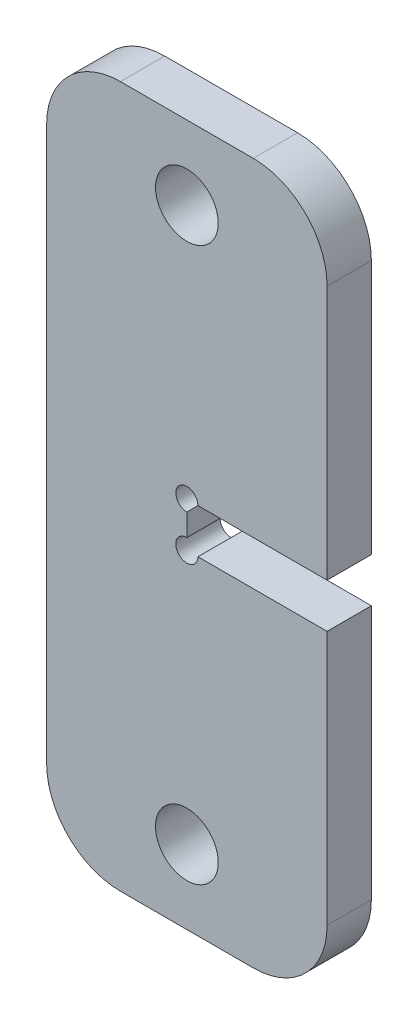
ISO-10303-21;
HEADER;
FILE_DESCRIPTION(('STEP AP214'),'2;1');
FILE_NAME('part.step','',(''),(''),'','','');
FILE_SCHEMA(('AUTOMOTIVE_DESIGN { 1 0 10303 214 1 1 1 1 }'));
ENDSEC;
DATA;
#1=APPLICATION_CONTEXT('core data for automotive mechanical design processes');
#2=APPLICATION_PROTOCOL_DEFINITION('international standard','automotive_design',2000,#1);
#3=PRODUCT_CONTEXT('',#1,'mechanical');
#4=PRODUCT('Part','Part','',(#3));
#5=PRODUCT_RELATED_PRODUCT_CATEGORY('part','',(#4));
#6=PRODUCT_DEFINITION_FORMATION('','',#4);
#7=PRODUCT_DEFINITION_CONTEXT('part definition',#1,'design');
#8=PRODUCT_DEFINITION('design','',#6,#7);
#9=PRODUCT_DEFINITION_SHAPE('','',#8);
#10=(LENGTH_UNIT() NAMED_UNIT(*) SI_UNIT(.MILLI.,.METRE.));
#11=(NAMED_UNIT(*) PLANE_ANGLE_UNIT() SI_UNIT($,.RADIAN.));
#12=(NAMED_UNIT(*) SI_UNIT($,.STERADIAN.) SOLID_ANGLE_UNIT());
#13=UNCERTAINTY_MEASURE_WITH_UNIT(LENGTH_MEASURE(1.E-05),#10,'distance_accuracy_value','');
#14=(GEOMETRIC_REPRESENTATION_CONTEXT(3) GLOBAL_UNCERTAINTY_ASSIGNED_CONTEXT((#13)) GLOBAL_UNIT_ASSIGNED_CONTEXT((#10,
#11,#12)) REPRESENTATION_CONTEXT('',''));
#15=CARTESIAN_POINT('',(0.,0.,0.));
#16=DIRECTION('',(0.,0.,1.));
#17=DIRECTION('',(1.,0.,0.));
#18=AXIS2_PLACEMENT_3D('',#15,#16,#17);
#19=CARTESIAN_POINT('',(714.,338.,11.));
#20=DIRECTION('',(0.,0.,1.));
#21=DIRECTION('',(1.,0.,0.));
#22=AXIS2_PLACEMENT_3D('',#19,#20,#21);
#23=PLANE('',#22);
#24=CARTESIAN_POINT('',(705.,378.5,11.));
#25=DIRECTION('',(0.,0.,1.));
#26=DIRECTION('',(1.,0.,0.));
#27=AXIS2_PLACEMENT_3D('',#24,#25,#26);
#28=CIRCLE('',#27,1.49999999999997);
#29=CARTESIAN_POINT('',(706.5,378.5,11.));
#30=VERTEX_POINT('',#29);
#31=CARTESIAN_POINT('',(705.,377.,11.));
#32=VERTEX_POINT('',#31);
#33=EDGE_CURVE('E136',#30,#32,#28,.T.);
#34=ORIENTED_EDGE('',*,*,#33,.F.);
#35=DIRECTION('',(-1.,0.,0.));
#36=VECTOR('',#35,1.);
#37=CARTESIAN_POINT('',(724.,378.5,11.));
#38=LINE('',#37,#36);
#39=CARTESIAN_POINT('',(724.,378.5,11.));
#40=VERTEX_POINT('',#39);
#41=EDGE_CURVE('E149',#40,#30,#38,.T.);
#42=ORIENTED_EDGE('',*,*,#41,.F.);
#43=DIRECTION('',(0.,-1.,0.));
#44=VECTOR('',#43,1.);
#45=CARTESIAN_POINT('',(724.,23.9999999999998,11.));
#46=LINE('',#45,#44);
#47=CARTESIAN_POINT('',(724.,413.,11.));
#48=VERTEX_POINT('',#47);
#49=EDGE_CURVE('E158',#48,#40,#46,.T.);
#50=ORIENTED_EDGE('',*,*,#49,.F.);
#51=CARTESIAN_POINT('',(714.,413.,11.));
#52=DIRECTION('',(0.,0.,1.));
#53=DIRECTION('',(1.,0.,0.));
#54=AXIS2_PLACEMENT_3D('',#51,#52,#53);
#55=CIRCLE('',#54,10.);
#56=CARTESIAN_POINT('',(714.,423.,11.));
#57=VERTEX_POINT('',#56);
#58=EDGE_CURVE('E166',#48,#57,#55,.T.);
#59=ORIENTED_EDGE('',*,*,#58,.T.);
#60=DIRECTION('',(1.,0.,0.));
#61=VECTOR('',#60,1.);
#62=CARTESIAN_POINT('',(724.,423.,11.));
#63=LINE('',#62,#61);
#64=CARTESIAN_POINT('',(696.,423.,11.));
#65=VERTEX_POINT('',#64);
#66=EDGE_CURVE('E312',#65,#57,#63,.T.);
#67=ORIENTED_EDGE('',*,*,#66,.F.);
#68=CARTESIAN_POINT('',(696.,413.,11.));
#69=DIRECTION('',(0.,0.,1.));
#70=DIRECTION('',(1.,0.,0.));
#71=AXIS2_PLACEMENT_3D('',#68,#69,#70);
#72=CIRCLE('',#71,10.);
#73=CARTESIAN_POINT('',(686.,413.,11.));
#74=VERTEX_POINT('',#73);
#75=EDGE_CURVE('E309',#65,#74,#72,.T.);
#76=ORIENTED_EDGE('',*,*,#75,.T.);
#77=DIRECTION('',(0.,1.,0.));
#78=VECTOR('',#77,1.);
#79=CARTESIAN_POINT('',(686.,23.9999999999998,11.));
#80=LINE('',#79,#78);
#81=CARTESIAN_POINT('',(686.,338.,11.));
#82=VERTEX_POINT('',#81);
#83=EDGE_CURVE('E305',#82,#74,#80,.T.);
#84=ORIENTED_EDGE('',*,*,#83,.F.);
#85=CARTESIAN_POINT('',(696.,338.,11.));
#86=DIRECTION('',(0.,0.,1.));
#87=DIRECTION('',(1.,0.,0.));
#88=AXIS2_PLACEMENT_3D('',#85,#86,#87);
#89=CIRCLE('',#88,10.);
#90=CARTESIAN_POINT('',(696.,328.,11.));
#91=VERTEX_POINT('',#90);
#92=EDGE_CURVE('E302',#82,#91,#89,.T.);
#93=ORIENTED_EDGE('',*,*,#92,.T.);
#94=DIRECTION('',(-1.,0.,0.));
#95=VECTOR('',#94,1.);
#96=CARTESIAN_POINT('',(724.,328.,11.));
#97=LINE('',#96,#95);
#98=CARTESIAN_POINT('',(714.,328.,11.));
#99=VERTEX_POINT('',#98);
#100=EDGE_CURVE('E298',#99,#91,#97,.T.);
#101=ORIENTED_EDGE('',*,*,#100,.F.);
#102=CARTESIAN_POINT('',(714.,338.,11.));
#103=DIRECTION('',(0.,0.,1.));
#104=DIRECTION('',(1.,0.,0.));
#105=AXIS2_PLACEMENT_3D('',#102,#103,#104);
#106=CIRCLE('',#105,10.);
#107=CARTESIAN_POINT('',(724.,338.,11.));
#108=VERTEX_POINT('',#107);
#109=EDGE_CURVE('E295',#99,#108,#106,.T.);
#110=ORIENTED_EDGE('',*,*,#109,.T.);
#111=DIRECTION('',(0.,-1.,0.));
#112=VECTOR('',#111,1.);
#113=CARTESIAN_POINT('',(724.,23.9999999999998,11.));
#114=LINE('',#113,#112);
#115=CARTESIAN_POINT('',(724.,372.5,11.));
#116=VERTEX_POINT('',#115);
#117=EDGE_CURVE('E293',#116,#108,#114,.T.);
#118=ORIENTED_EDGE('',*,*,#117,.F.);
#119=DIRECTION('',(1.,0.,0.));
#120=VECTOR('',#119,1.);
#121=CARTESIAN_POINT('',(724.,372.5,11.));
#122=LINE('',#121,#120);
#123=CARTESIAN_POINT('',(706.5,372.5,11.));
#124=VERTEX_POINT('',#123);
#125=EDGE_CURVE('E217',#124,#116,#122,.T.);
#126=ORIENTED_EDGE('',*,*,#125,.F.);
#127=CARTESIAN_POINT('',(705.,372.5,11.));
#128=DIRECTION('',(0.,0.,1.));
#129=DIRECTION('',(1.,0.,0.));
#130=AXIS2_PLACEMENT_3D('',#127,#128,#129);
#131=CIRCLE('',#130,1.49999999999997);
#132=CARTESIAN_POINT('',(705.,374.,11.));
#133=VERTEX_POINT('',#132);
#134=EDGE_CURVE('E265',#133,#124,#131,.T.);
#135=ORIENTED_EDGE('',*,*,#134,.F.);
#136=DIRECTION('',(0.,-1.,0.));
#137=VECTOR('',#136,1.);
#138=CARTESIAN_POINT('',(705.,23.9999999999998,11.));
#139=LINE('',#138,#137);
#140=EDGE_CURVE('E153',#32,#133,#139,.T.);
#141=ORIENTED_EDGE('',*,*,#140,.F.);
#142=EDGE_LOOP('',(#34,#42,#50,#59,#67,#76,#84,#93,#101,#110,#118,#126,#135,#141));
#143=FACE_BOUND('',#142,.T.);
#144=CARTESIAN_POINT('',(705.,338.,11.));
#145=DIRECTION('',(0.,0.,1.));
#146=DIRECTION('',(1.,0.,0.));
#147=AXIS2_PLACEMENT_3D('',#144,#145,#146);
#148=CIRCLE('',#147,4.25000000000001);
#149=CARTESIAN_POINT('',(709.25,338.,11.));
#150=VERTEX_POINT('',#149);
#151=EDGE_CURVE('E174',#150,#150,#148,.T.);
#152=ORIENTED_EDGE('',*,*,#151,.F.);
#153=EDGE_LOOP('',(#152));
#154=FACE_BOUND('',#153,.T.);
#155=CARTESIAN_POINT('',(705.,413.,11.));
#156=DIRECTION('',(0.,0.,1.));
#157=DIRECTION('',(1.,0.,0.));
#158=AXIS2_PLACEMENT_3D('',#155,#156,#157);
#159=CIRCLE('',#158,4.25000000000001);
#160=CARTESIAN_POINT('',(709.25,413.,11.));
#161=VERTEX_POINT('',#160);
#162=EDGE_CURVE('E279',#161,#161,#159,.T.);
#163=ORIENTED_EDGE('',*,*,#162,.F.);
#164=EDGE_LOOP('',(#163));
#165=FACE_BOUND('',#164,.T.);
#166=ADVANCED_FACE('F36',(#143,#154,#165),#23,.T.);
#167=CARTESIAN_POINT('',(714.,338.,5.));
#168=DIRECTION('',(0.,0.,1.));
#169=DIRECTION('',(1.,0.,0.));
#170=AXIS2_PLACEMENT_3D('',#167,#168,#169);
#171=PLANE('',#170);
#172=DIRECTION('',(-1.,0.,0.));
#173=VECTOR('',#172,1.);
#174=CARTESIAN_POINT('',(724.,378.5,5.));
#175=LINE('',#174,#173);
#176=CARTESIAN_POINT('',(724.,378.5,5.));
#177=VERTEX_POINT('',#176);
#178=CARTESIAN_POINT('',(706.5,378.5,5.));
#179=VERTEX_POINT('',#178);
#180=EDGE_CURVE('E210',#177,#179,#175,.T.);
#181=ORIENTED_EDGE('',*,*,#180,.T.);
#182=CARTESIAN_POINT('',(705.,378.5,5.));
#183=DIRECTION('',(0.,0.,1.));
#184=DIRECTION('',(1.,0.,0.));
#185=AXIS2_PLACEMENT_3D('',#182,#183,#184);
#186=CIRCLE('',#185,1.49999999999997);
#187=CARTESIAN_POINT('',(705.,377.,5.));
#188=VERTEX_POINT('',#187);
#189=EDGE_CURVE('E59',#179,#188,#186,.T.);
#190=ORIENTED_EDGE('',*,*,#189,.T.);
#191=DIRECTION('',(0.,-1.,0.));
#192=VECTOR('',#191,1.);
#193=CARTESIAN_POINT('',(705.,23.9999999999998,5.));
#194=LINE('',#193,#192);
#195=CARTESIAN_POINT('',(705.,374.,5.));
#196=VERTEX_POINT('',#195);
#197=EDGE_CURVE('E213',#188,#196,#194,.T.);
#198=ORIENTED_EDGE('',*,*,#197,.T.);
#199=CARTESIAN_POINT('',(705.,372.5,5.));
#200=DIRECTION('',(0.,0.,1.));
#201=DIRECTION('',(1.,0.,0.));
#202=AXIS2_PLACEMENT_3D('',#199,#200,#201);
#203=CIRCLE('',#202,1.49999999999997);
#204=CARTESIAN_POINT('',(706.5,372.5,5.));
#205=VERTEX_POINT('',#204);
#206=EDGE_CURVE('E51',#196,#205,#203,.T.);
#207=ORIENTED_EDGE('',*,*,#206,.T.);
#208=DIRECTION('',(1.,0.,0.));
#209=VECTOR('',#208,1.);
#210=CARTESIAN_POINT('',(724.,372.5,5.));
#211=LINE('',#210,#209);
#212=CARTESIAN_POINT('',(724.,372.5,5.));
#213=VERTEX_POINT('',#212);
#214=EDGE_CURVE('E170',#205,#213,#211,.T.);
#215=ORIENTED_EDGE('',*,*,#214,.T.);
#216=DIRECTION('',(0.,-1.,0.));
#217=VECTOR('',#216,1.);
#218=CARTESIAN_POINT('',(724.,23.9999999999998,5.));
#219=LINE('',#218,#217);
#220=CARTESIAN_POINT('',(724.,338.,5.));
#221=VERTEX_POINT('',#220);
#222=EDGE_CURVE('E173',#213,#221,#219,.T.);
#223=ORIENTED_EDGE('',*,*,#222,.T.);
#224=CARTESIAN_POINT('',(714.,338.,5.));
#225=DIRECTION('',(0.,0.,1.));
#226=DIRECTION('',(1.,0.,0.));
#227=AXIS2_PLACEMENT_3D('',#224,#225,#226);
#228=CIRCLE('',#227,10.);
#229=CARTESIAN_POINT('',(714.,328.,5.));
#230=VERTEX_POINT('',#229);
#231=EDGE_CURVE('E178',#230,#221,#228,.T.);
#232=ORIENTED_EDGE('',*,*,#231,.F.);
#233=DIRECTION('',(-1.,0.,0.));
#234=VECTOR('',#233,1.);
#235=CARTESIAN_POINT('',(724.,328.,5.));
#236=LINE('',#235,#234);
#237=CARTESIAN_POINT('',(696.,328.,5.));
#238=VERTEX_POINT('',#237);
#239=EDGE_CURVE('E182',#230,#238,#236,.T.);
#240=ORIENTED_EDGE('',*,*,#239,.T.);
#241=CARTESIAN_POINT('',(696.,338.,5.));
#242=DIRECTION('',(0.,0.,1.));
#243=DIRECTION('',(1.,0.,0.));
#244=AXIS2_PLACEMENT_3D('',#241,#242,#243);
#245=CIRCLE('',#244,10.);
#246=CARTESIAN_POINT('',(686.,338.,5.));
#247=VERTEX_POINT('',#246);
#248=EDGE_CURVE('E186',#247,#238,#245,.T.);
#249=ORIENTED_EDGE('',*,*,#248,.F.);
#250=DIRECTION('',(0.,1.,0.));
#251=VECTOR('',#250,1.);
#252=CARTESIAN_POINT('',(686.,23.9999999999998,5.));
#253=LINE('',#252,#251);
#254=CARTESIAN_POINT('',(686.,413.,5.));
#255=VERTEX_POINT('',#254);
#256=EDGE_CURVE('E190',#247,#255,#253,.T.);
#257=ORIENTED_EDGE('',*,*,#256,.T.);
#258=CARTESIAN_POINT('',(696.,413.,5.));
#259=DIRECTION('',(0.,0.,1.));
#260=DIRECTION('',(1.,0.,0.));
#261=AXIS2_PLACEMENT_3D('',#258,#259,#260);
#262=CIRCLE('',#261,10.);
#263=CARTESIAN_POINT('',(696.,423.,5.));
#264=VERTEX_POINT('',#263);
#265=EDGE_CURVE('E194',#264,#255,#262,.T.);
#266=ORIENTED_EDGE('',*,*,#265,.F.);
#267=DIRECTION('',(1.,0.,0.));
#268=VECTOR('',#267,1.);
#269=CARTESIAN_POINT('',(724.,423.,5.));
#270=LINE('',#269,#268);
#271=CARTESIAN_POINT('',(714.,423.,5.));
#272=VERTEX_POINT('',#271);
#273=EDGE_CURVE('E198',#264,#272,#270,.T.);
#274=ORIENTED_EDGE('',*,*,#273,.T.);
#275=CARTESIAN_POINT('',(714.,413.,5.));
#276=DIRECTION('',(0.,0.,1.));
#277=DIRECTION('',(1.,0.,0.));
#278=AXIS2_PLACEMENT_3D('',#275,#276,#277);
#279=CIRCLE('',#278,10.);
#280=CARTESIAN_POINT('',(724.,413.,5.));
#281=VERTEX_POINT('',#280);
#282=EDGE_CURVE('E202',#281,#272,#279,.T.);
#283=ORIENTED_EDGE('',*,*,#282,.F.);
#284=DIRECTION('',(0.,-1.,0.));
#285=VECTOR('',#284,1.);
#286=CARTESIAN_POINT('',(724.,23.9999999999998,5.));
#287=LINE('',#286,#285);
#288=EDGE_CURVE('E206',#281,#177,#287,.T.);
#289=ORIENTED_EDGE('',*,*,#288,.T.);
#290=EDGE_LOOP('',(#181,#190,#198,#207,#215,#223,#232,#240,#249,#257,#266,#274,#283,#289));
#291=FACE_BOUND('',#290,.T.);
#292=CARTESIAN_POINT('',(705.,338.,5.));
#293=DIRECTION('',(0.,0.,1.));
#294=DIRECTION('',(1.,0.,0.));
#295=AXIS2_PLACEMENT_3D('',#292,#293,#294);
#296=CIRCLE('',#295,4.25000000000001);
#297=CARTESIAN_POINT('',(709.25,338.,5.));
#298=VERTEX_POINT('',#297);
#299=EDGE_CURVE('E282',#298,#298,#296,.T.);
#300=ORIENTED_EDGE('',*,*,#299,.T.);
#301=EDGE_LOOP('',(#300));
#302=FACE_BOUND('',#301,.T.);
#303=CARTESIAN_POINT('',(705.,413.,5.));
#304=DIRECTION('',(0.,0.,1.));
#305=DIRECTION('',(1.,0.,0.));
#306=AXIS2_PLACEMENT_3D('',#303,#304,#305);
#307=CIRCLE('',#306,4.25000000000001);
#308=CARTESIAN_POINT('',(709.25,413.,5.));
#309=VERTEX_POINT('',#308);
#310=EDGE_CURVE('E278',#309,#309,#307,.T.);
#311=ORIENTED_EDGE('',*,*,#310,.T.);
#312=EDGE_LOOP('',(#311));
#313=FACE_BOUND('',#312,.T.);
#314=ADVANCED_FACE('F260',(#291,#302,#313),#171,.F.);
#315=CARTESIAN_POINT('',(724.,372.5,11.));
#316=DIRECTION('',(0.,1.,0.));
#317=DIRECTION('',(0.,0.,1.));
#318=AXIS2_PLACEMENT_3D('',#315,#316,#317);
#319=PLANE('',#318);
#320=DIRECTION('',(0.,0.,1.));
#321=VECTOR('',#320,1.);
#322=CARTESIAN_POINT('',(706.5,372.5,5.));
#323=LINE('',#322,#321);
#324=EDGE_CURVE('E275',#124,#205,#323,.F.);
#325=ORIENTED_EDGE('',*,*,#324,.F.);
#326=ORIENTED_EDGE('',*,*,#125,.T.);
#327=DIRECTION('',(0.,0.,-1.));
#328=VECTOR('',#327,1.);
#329=CARTESIAN_POINT('',(724.,372.5,11.));
#330=LINE('',#329,#328);
#331=EDGE_CURVE('E163',#116,#213,#330,.T.);
#332=ORIENTED_EDGE('',*,*,#331,.T.);
#333=ORIENTED_EDGE('',*,*,#214,.F.);
#334=EDGE_LOOP('',(#325,#326,#332,#333));
#335=FACE_BOUND('',#334,.T.);
#336=ADVANCED_FACE('F38',(#335),#319,.T.);
#337=CARTESIAN_POINT('',(705.,23.9999999999998,11.));
#338=DIRECTION('',(1.,0.,0.));
#339=DIRECTION('',(0.,0.,-1.));
#340=AXIS2_PLACEMENT_3D('',#337,#338,#339);
#341=PLANE('',#340);
#342=DIRECTION('',(0.,0.,1.));
#343=VECTOR('',#342,1.);
#344=CARTESIAN_POINT('',(705.,377.,5.));
#345=LINE('',#344,#343);
#346=EDGE_CURVE('E272',#32,#188,#345,.F.);
#347=ORIENTED_EDGE('',*,*,#346,.F.);
#348=ORIENTED_EDGE('',*,*,#140,.T.);
#349=DIRECTION('',(0.,0.,1.));
#350=VECTOR('',#349,1.);
#351=CARTESIAN_POINT('',(705.,374.,5.));
#352=LINE('',#351,#350);
#353=EDGE_CURVE('E11',#196,#133,#352,.T.);
#354=ORIENTED_EDGE('',*,*,#353,.F.);
#355=ORIENTED_EDGE('',*,*,#197,.F.);
#356=EDGE_LOOP('',(#347,#348,#354,#355));
#357=FACE_BOUND('',#356,.T.);
#358=ADVANCED_FACE('F361',(#357),#341,.T.);
#359=CARTESIAN_POINT('',(724.,378.5,11.));
#360=DIRECTION('',(0.,-1.,0.));
#361=DIRECTION('',(0.,0.,-1.));
#362=AXIS2_PLACEMENT_3D('',#359,#360,#361);
#363=PLANE('',#362);
#364=DIRECTION('',(0.,0.,1.));
#365=VECTOR('',#364,1.);
#366=CARTESIAN_POINT('',(706.5,378.5,5.));
#367=LINE('',#366,#365);
#368=EDGE_CURVE('E45',#179,#30,#367,.T.);
#369=ORIENTED_EDGE('',*,*,#368,.F.);
#370=ORIENTED_EDGE('',*,*,#180,.F.);
#371=DIRECTION('',(0.,0.,-1.));
#372=VECTOR('',#371,1.);
#373=CARTESIAN_POINT('',(724.,378.5,11.));
#374=LINE('',#373,#372);
#375=EDGE_CURVE('E143',#40,#177,#374,.T.);
#376=ORIENTED_EDGE('',*,*,#375,.F.);
#377=ORIENTED_EDGE('',*,*,#41,.T.);
#378=EDGE_LOOP('',(#369,#370,#376,#377));
#379=FACE_BOUND('',#378,.T.);
#380=ADVANCED_FACE('F156',(#379),#363,.T.);
#381=CARTESIAN_POINT('',(724.,23.9999999999998,11.));
#382=DIRECTION('',(1.,0.,0.));
#383=DIRECTION('',(0.,0.,-1.));
#384=AXIS2_PLACEMENT_3D('',#381,#382,#383);
#385=PLANE('',#384);
#386=ORIENTED_EDGE('',*,*,#288,.F.);
#387=DIRECTION('',(0.,0.,-1.));
#388=VECTOR('',#387,1.);
#389=CARTESIAN_POINT('',(724.,413.,11.));
#390=LINE('',#389,#388);
#391=EDGE_CURVE('E220',#48,#281,#390,.T.);
#392=ORIENTED_EDGE('',*,*,#391,.F.);
#393=ORIENTED_EDGE('',*,*,#49,.T.);
#394=ORIENTED_EDGE('',*,*,#375,.T.);
#395=EDGE_LOOP('',(#386,#392,#393,#394));
#396=FACE_BOUND('',#395,.T.);
#397=ADVANCED_FACE('F367',(#396),#385,.T.);
#398=CARTESIAN_POINT('',(714.,413.,11.));
#399=DIRECTION('',(0.,0.,-1.));
#400=DIRECTION('',(-1.,0.,0.));
#401=AXIS2_PLACEMENT_3D('',#398,#399,#400);
#402=CYLINDRICAL_SURFACE('',#401,10.);
#403=ORIENTED_EDGE('',*,*,#282,.T.);
#404=DIRECTION('',(0.,0.,-1.));
#405=VECTOR('',#404,1.);
#406=CARTESIAN_POINT('',(714.,423.,11.));
#407=LINE('',#406,#405);
#408=EDGE_CURVE('E223',#57,#272,#407,.T.);
#409=ORIENTED_EDGE('',*,*,#408,.F.);
#410=ORIENTED_EDGE('',*,*,#58,.F.);
#411=ORIENTED_EDGE('',*,*,#391,.T.);
#412=EDGE_LOOP('',(#403,#409,#410,#411));
#413=FACE_BOUND('',#412,.T.);
#414=ADVANCED_FACE('F319',(#413),#402,.T.);
#415=CARTESIAN_POINT('',(724.,423.,11.));
#416=DIRECTION('',(0.,1.,0.));
#417=DIRECTION('',(0.,0.,1.));
#418=AXIS2_PLACEMENT_3D('',#415,#416,#417);
#419=PLANE('',#418);
#420=ORIENTED_EDGE('',*,*,#273,.F.);
#421=DIRECTION('',(0.,0.,-1.));
#422=VECTOR('',#421,1.);
#423=CARTESIAN_POINT('',(696.,423.,11.));
#424=LINE('',#423,#422);
#425=EDGE_CURVE('E225',#65,#264,#424,.T.);
#426=ORIENTED_EDGE('',*,*,#425,.F.);
#427=ORIENTED_EDGE('',*,*,#66,.T.);
#428=ORIENTED_EDGE('',*,*,#408,.T.);
#429=EDGE_LOOP('',(#420,#426,#427,#428));
#430=FACE_BOUND('',#429,.T.);
#431=ADVANCED_FACE('F323',(#430),#419,.T.);
#432=CARTESIAN_POINT('',(696.,413.,11.));
#433=DIRECTION('',(0.,0.,-1.));
#434=DIRECTION('',(-1.,0.,0.));
#435=AXIS2_PLACEMENT_3D('',#432,#433,#434);
#436=CYLINDRICAL_SURFACE('',#435,10.);
#437=ORIENTED_EDGE('',*,*,#265,.T.);
#438=DIRECTION('',(0.,0.,-1.));
#439=VECTOR('',#438,1.);
#440=CARTESIAN_POINT('',(686.,413.,11.));
#441=LINE('',#440,#439);
#442=EDGE_CURVE('E228',#74,#255,#441,.T.);
#443=ORIENTED_EDGE('',*,*,#442,.F.);
#444=ORIENTED_EDGE('',*,*,#75,.F.);
#445=ORIENTED_EDGE('',*,*,#425,.T.);
#446=EDGE_LOOP('',(#437,#443,#444,#445));
#447=FACE_BOUND('',#446,.T.);
#448=ADVANCED_FACE('F328',(#447),#436,.T.);
#449=CARTESIAN_POINT('',(686.,23.9999999999998,11.));
#450=DIRECTION('',(-1.,0.,0.));
#451=DIRECTION('',(0.,0.,1.));
#452=AXIS2_PLACEMENT_3D('',#449,#450,#451);
#453=PLANE('',#452);
#454=ORIENTED_EDGE('',*,*,#256,.F.);
#455=DIRECTION('',(0.,0.,-1.));
#456=VECTOR('',#455,1.);
#457=CARTESIAN_POINT('',(686.,338.,11.));
#458=LINE('',#457,#456);
#459=EDGE_CURVE('E231',#82,#247,#458,.T.);
#460=ORIENTED_EDGE('',*,*,#459,.F.);
#461=ORIENTED_EDGE('',*,*,#83,.T.);
#462=ORIENTED_EDGE('',*,*,#442,.T.);
#463=EDGE_LOOP('',(#454,#460,#461,#462));
#464=FACE_BOUND('',#463,.T.);
#465=ADVANCED_FACE('F335',(#464),#453,.T.);
#466=CARTESIAN_POINT('',(696.,338.,11.));
#467=DIRECTION('',(0.,0.,-1.));
#468=DIRECTION('',(-1.,0.,0.));
#469=AXIS2_PLACEMENT_3D('',#466,#467,#468);
#470=CYLINDRICAL_SURFACE('',#469,10.);
#471=ORIENTED_EDGE('',*,*,#248,.T.);
#472=DIRECTION('',(0.,0.,-1.));
#473=VECTOR('',#472,1.);
#474=CARTESIAN_POINT('',(696.,328.,11.));
#475=LINE('',#474,#473);
#476=EDGE_CURVE('E234',#91,#238,#475,.T.);
#477=ORIENTED_EDGE('',*,*,#476,.F.);
#478=ORIENTED_EDGE('',*,*,#92,.F.);
#479=ORIENTED_EDGE('',*,*,#459,.T.);
#480=EDGE_LOOP('',(#471,#477,#478,#479));
#481=FACE_BOUND('',#480,.T.);
#482=ADVANCED_FACE('F338',(#481),#470,.T.);
#483=CARTESIAN_POINT('',(724.,328.,11.));
#484=DIRECTION('',(0.,-1.,0.));
#485=DIRECTION('',(0.,0.,-1.));
#486=AXIS2_PLACEMENT_3D('',#483,#484,#485);
#487=PLANE('',#486);
#488=ORIENTED_EDGE('',*,*,#239,.F.);
#489=DIRECTION('',(0.,0.,-1.));
#490=VECTOR('',#489,1.);
#491=CARTESIAN_POINT('',(714.,328.,11.));
#492=LINE('',#491,#490);
#493=EDGE_CURVE('E237',#99,#230,#492,.T.);
#494=ORIENTED_EDGE('',*,*,#493,.F.);
#495=ORIENTED_EDGE('',*,*,#100,.T.);
#496=ORIENTED_EDGE('',*,*,#476,.T.);
#497=EDGE_LOOP('',(#488,#494,#495,#496));
#498=FACE_BOUND('',#497,.T.);
#499=ADVANCED_FACE('F340',(#498),#487,.T.);
#500=CARTESIAN_POINT('',(714.,338.,11.));
#501=DIRECTION('',(0.,0.,-1.));
#502=DIRECTION('',(-1.,0.,0.));
#503=AXIS2_PLACEMENT_3D('',#500,#501,#502);
#504=CYLINDRICAL_SURFACE('',#503,10.);
#505=ORIENTED_EDGE('',*,*,#231,.T.);
#506=DIRECTION('',(0.,0.,-1.));
#507=VECTOR('',#506,1.);
#508=CARTESIAN_POINT('',(724.,338.,11.));
#509=LINE('',#508,#507);
#510=EDGE_CURVE('E240',#108,#221,#509,.T.);
#511=ORIENTED_EDGE('',*,*,#510,.F.);
#512=ORIENTED_EDGE('',*,*,#109,.F.);
#513=ORIENTED_EDGE('',*,*,#493,.T.);
#514=EDGE_LOOP('',(#505,#511,#512,#513));
#515=FACE_BOUND('',#514,.T.);
#516=ADVANCED_FACE('F343',(#515),#504,.T.);
#517=CARTESIAN_POINT('',(724.,23.9999999999998,11.));
#518=DIRECTION('',(1.,0.,0.));
#519=DIRECTION('',(0.,0.,-1.));
#520=AXIS2_PLACEMENT_3D('',#517,#518,#519);
#521=PLANE('',#520);
#522=ORIENTED_EDGE('',*,*,#222,.F.);
#523=ORIENTED_EDGE('',*,*,#331,.F.);
#524=ORIENTED_EDGE('',*,*,#117,.T.);
#525=ORIENTED_EDGE('',*,*,#510,.T.);
#526=EDGE_LOOP('',(#522,#523,#524,#525));
#527=FACE_BOUND('',#526,.T.);
#528=ADVANCED_FACE('F256',(#527),#521,.T.);
#529=CARTESIAN_POINT('',(705.,338.,11.));
#530=DIRECTION('',(0.,0.,-1.));
#531=DIRECTION('',(-1.,0.,0.));
#532=AXIS2_PLACEMENT_3D('',#529,#530,#531);
#533=CYLINDRICAL_SURFACE('',#532,4.25000000000001);
#534=ORIENTED_EDGE('',*,*,#151,.T.);
#535=EDGE_LOOP('',(#534));
#536=FACE_BOUND('',#535,.T.);
#537=ORIENTED_EDGE('',*,*,#299,.F.);
#538=EDGE_LOOP('',(#537));
#539=FACE_BOUND('',#538,.T.);
#540=ADVANCED_FACE('F350',(#536,#539),#533,.F.);
#541=CARTESIAN_POINT('',(705.,413.,11.));
#542=DIRECTION('',(0.,0.,-1.));
#543=DIRECTION('',(-1.,0.,0.));
#544=AXIS2_PLACEMENT_3D('',#541,#542,#543);
#545=CYLINDRICAL_SURFACE('',#544,4.25000000000001);
#546=ORIENTED_EDGE('',*,*,#162,.T.);
#547=EDGE_LOOP('',(#546));
#548=FACE_BOUND('',#547,.T.);
#549=ORIENTED_EDGE('',*,*,#310,.F.);
#550=EDGE_LOOP('',(#549));
#551=FACE_BOUND('',#550,.T.);
#552=ADVANCED_FACE('F402',(#548,#551),#545,.F.);
#553=CARTESIAN_POINT('',(705.,378.5,5.));
#554=DIRECTION('',(0.,0.,1.));
#555=DIRECTION('',(1.,0.,0.));
#556=AXIS2_PLACEMENT_3D('',#553,#554,#555);
#557=CYLINDRICAL_SURFACE('',#556,1.49999999999997);
#558=ORIENTED_EDGE('',*,*,#346,.T.);
#559=ORIENTED_EDGE('',*,*,#189,.F.);
#560=ORIENTED_EDGE('',*,*,#368,.T.);
#561=ORIENTED_EDGE('',*,*,#33,.T.);
#562=EDGE_LOOP('',(#558,#559,#560,#561));
#563=FACE_BOUND('',#562,.T.);
#564=ADVANCED_FACE('F135',(#563),#557,.F.);
#565=CARTESIAN_POINT('',(705.,372.5,5.));
#566=DIRECTION('',(0.,0.,1.));
#567=DIRECTION('',(1.,0.,0.));
#568=AXIS2_PLACEMENT_3D('',#565,#566,#567);
#569=CYLINDRICAL_SURFACE('',#568,1.49999999999997);
#570=ORIENTED_EDGE('',*,*,#324,.T.);
#571=ORIENTED_EDGE('',*,*,#206,.F.);
#572=ORIENTED_EDGE('',*,*,#353,.T.);
#573=ORIENTED_EDGE('',*,*,#134,.T.);
#574=EDGE_LOOP('',(#570,#571,#572,#573));
#575=FACE_BOUND('',#574,.T.);
#576=ADVANCED_FACE('F418',(#575),#569,.F.);
#577=CLOSED_SHELL('',(#166,#314,#336,#358,#380,#397,#414,#431,#448,#465,#482,#499,#516,#528,
#540,#552,#564,#576));
#578=MANIFOLD_SOLID_BREP('B2',#577);
#579=ADVANCED_BREP_SHAPE_REPRESENTATION('',(#18,#578),#14);
#580=SHAPE_DEFINITION_REPRESENTATION(#9,#579);
ENDSEC;
END-ISO-10303-21;
